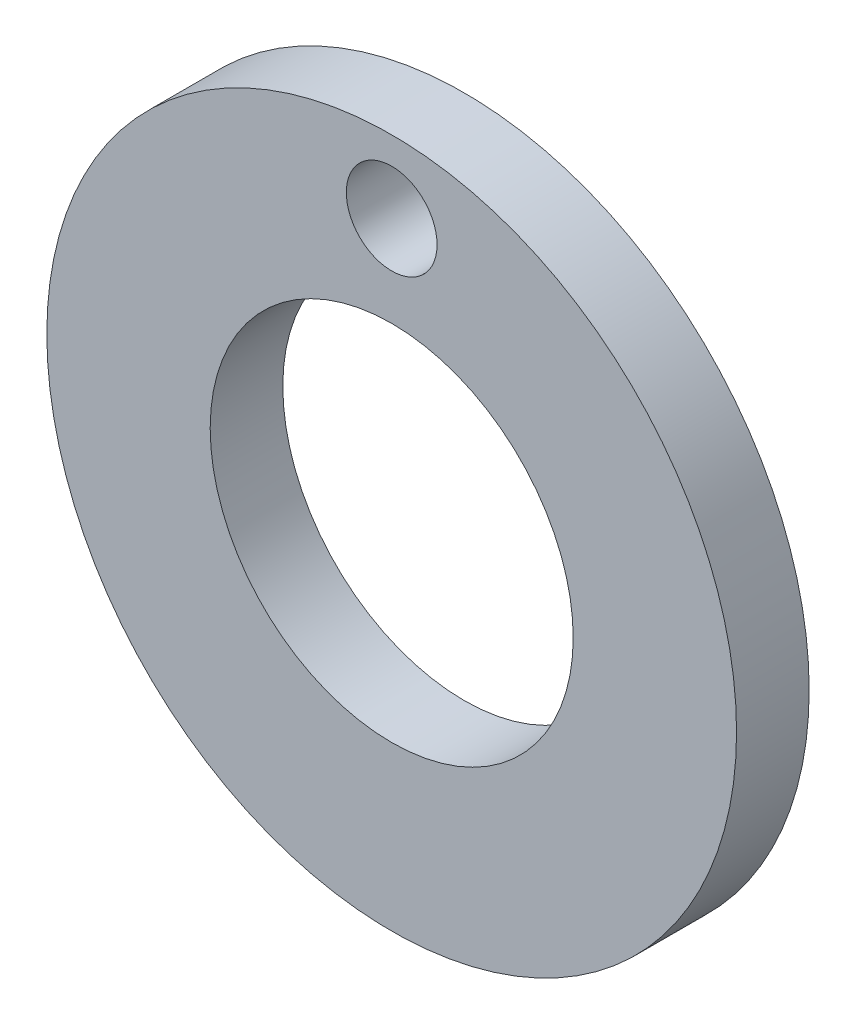
ISO-10303-21;
HEADER;
FILE_DESCRIPTION(('STEP AP214'),'2;1');
FILE_NAME('part.step','',(''),(''),'','','');
FILE_SCHEMA(('AUTOMOTIVE_DESIGN { 1 0 10303 214 1 1 1 1 }'));
ENDSEC;
DATA;
#1=APPLICATION_CONTEXT('core data for automotive mechanical design processes');
#2=APPLICATION_PROTOCOL_DEFINITION('international standard','automotive_design',2000,#1);
#3=PRODUCT_CONTEXT('',#1,'mechanical');
#4=PRODUCT('Part','Part','',(#3));
#5=PRODUCT_RELATED_PRODUCT_CATEGORY('part','',(#4));
#6=PRODUCT_DEFINITION_FORMATION('','',#4);
#7=PRODUCT_DEFINITION_CONTEXT('part definition',#1,'design');
#8=PRODUCT_DEFINITION('design','',#6,#7);
#9=PRODUCT_DEFINITION_SHAPE('','',#8);
#10=(LENGTH_UNIT() NAMED_UNIT(*) SI_UNIT(.MILLI.,.METRE.));
#11=(NAMED_UNIT(*) PLANE_ANGLE_UNIT() SI_UNIT($,.RADIAN.));
#12=(NAMED_UNIT(*) SI_UNIT($,.STERADIAN.) SOLID_ANGLE_UNIT());
#13=UNCERTAINTY_MEASURE_WITH_UNIT(LENGTH_MEASURE(1.E-05),#10,'distance_accuracy_value','');
#14=(GEOMETRIC_REPRESENTATION_CONTEXT(3) GLOBAL_UNCERTAINTY_ASSIGNED_CONTEXT((#13)) GLOBAL_UNIT_ASSIGNED_CONTEXT((#10,
#11,#12)) REPRESENTATION_CONTEXT('',''));
#15=CARTESIAN_POINT('',(0.,0.,0.));
#16=DIRECTION('',(0.,0.,1.));
#17=DIRECTION('',(1.,0.,0.));
#18=AXIS2_PLACEMENT_3D('',#15,#16,#17);
#19=CARTESIAN_POINT('',(0.,0.,2.));
#20=DIRECTION('',(0.,0.,-1.));
#21=DIRECTION('',(-1.,0.,0.));
#22=AXIS2_PLACEMENT_3D('',#19,#20,#21);
#23=CYLINDRICAL_SURFACE('',#22,9.5);
#24=CARTESIAN_POINT('',(0.,0.,2.));
#25=DIRECTION('',(0.,0.,1.));
#26=DIRECTION('',(1.,0.,0.));
#27=AXIS2_PLACEMENT_3D('',#24,#25,#26);
#28=CIRCLE('',#27,9.5);
#29=CARTESIAN_POINT('',(9.5,0.,2.));
#30=VERTEX_POINT('',#29);
#31=EDGE_CURVE('E48',#30,#30,#28,.T.);
#32=ORIENTED_EDGE('',*,*,#31,.F.);
#33=EDGE_LOOP('',(#32));
#34=FACE_BOUND('',#33,.T.);
#35=CARTESIAN_POINT('',(0.,0.,0.));
#36=DIRECTION('',(0.,0.,1.));
#37=DIRECTION('',(1.,0.,0.));
#38=AXIS2_PLACEMENT_3D('',#35,#36,#37);
#39=CIRCLE('',#38,9.5);
#40=CARTESIAN_POINT('',(9.5,0.,0.));
#41=VERTEX_POINT('',#40);
#42=EDGE_CURVE('E61',#41,#41,#39,.T.);
#43=ORIENTED_EDGE('',*,*,#42,.T.);
#44=EDGE_LOOP('',(#43));
#45=FACE_BOUND('',#44,.T.);
#46=ADVANCED_FACE('F39',(#34,#45),#23,.T.);
#47=CARTESIAN_POINT('',(0.,7.5,2.));
#48=DIRECTION('',(0.,0.,-1.));
#49=DIRECTION('',(-1.,0.,0.));
#50=AXIS2_PLACEMENT_3D('',#47,#48,#49);
#51=CYLINDRICAL_SURFACE('',#50,1.25);
#52=CARTESIAN_POINT('',(0.,7.5,2.));
#53=DIRECTION('',(0.,0.,1.));
#54=DIRECTION('',(1.,0.,0.));
#55=AXIS2_PLACEMENT_3D('',#52,#53,#54);
#56=CIRCLE('',#55,1.25);
#57=CARTESIAN_POINT('',(1.25,7.5,2.));
#58=VERTEX_POINT('',#57);
#59=EDGE_CURVE('E54',#58,#58,#56,.T.);
#60=ORIENTED_EDGE('',*,*,#59,.T.);
#61=EDGE_LOOP('',(#60));
#62=FACE_BOUND('',#61,.T.);
#63=CARTESIAN_POINT('',(0.,7.5,0.));
#64=DIRECTION('',(0.,0.,1.));
#65=DIRECTION('',(1.,0.,0.));
#66=AXIS2_PLACEMENT_3D('',#63,#64,#65);
#67=CIRCLE('',#66,1.25);
#68=CARTESIAN_POINT('',(1.25,7.5,0.));
#69=VERTEX_POINT('',#68);
#70=EDGE_CURVE('E58',#69,#69,#67,.T.);
#71=ORIENTED_EDGE('',*,*,#70,.F.);
#72=EDGE_LOOP('',(#71));
#73=FACE_BOUND('',#72,.T.);
#74=ADVANCED_FACE('F41',(#62,#73),#51,.F.);
#75=CARTESIAN_POINT('',(0.,0.,2.));
#76=DIRECTION('',(0.,0.,-1.));
#77=DIRECTION('',(-1.,0.,0.));
#78=AXIS2_PLACEMENT_3D('',#75,#76,#77);
#79=CYLINDRICAL_SURFACE('',#78,5.);
#80=CARTESIAN_POINT('',(0.,0.,2.));
#81=DIRECTION('',(0.,0.,1.));
#82=DIRECTION('',(1.,0.,0.));
#83=AXIS2_PLACEMENT_3D('',#80,#81,#82);
#84=CIRCLE('',#83,5.);
#85=CARTESIAN_POINT('',(5.,0.,2.));
#86=VERTEX_POINT('',#85);
#87=EDGE_CURVE('E10',#86,#86,#84,.T.);
#88=ORIENTED_EDGE('',*,*,#87,.T.);
#89=EDGE_LOOP('',(#88));
#90=FACE_BOUND('',#89,.T.);
#91=CARTESIAN_POINT('',(0.,0.,0.));
#92=DIRECTION('',(0.,0.,1.));
#93=DIRECTION('',(1.,0.,0.));
#94=AXIS2_PLACEMENT_3D('',#91,#92,#93);
#95=CIRCLE('',#94,5.);
#96=CARTESIAN_POINT('',(5.,0.,0.));
#97=VERTEX_POINT('',#96);
#98=EDGE_CURVE('E43',#97,#97,#95,.T.);
#99=ORIENTED_EDGE('',*,*,#98,.F.);
#100=EDGE_LOOP('',(#99));
#101=FACE_BOUND('',#100,.T.);
#102=ADVANCED_FACE('F80',(#90,#101),#79,.F.);
#103=CARTESIAN_POINT('',(0.,0.,2.));
#104=DIRECTION('',(0.,0.,1.));
#105=DIRECTION('',(1.,0.,0.));
#106=AXIS2_PLACEMENT_3D('',#103,#104,#105);
#107=PLANE('',#106);
#108=ORIENTED_EDGE('',*,*,#59,.F.);
#109=EDGE_LOOP('',(#108));
#110=FACE_BOUND('',#109,.T.);
#111=ORIENTED_EDGE('',*,*,#31,.T.);
#112=EDGE_LOOP('',(#111));
#113=FACE_BOUND('',#112,.T.);
#114=ORIENTED_EDGE('',*,*,#87,.F.);
#115=EDGE_LOOP('',(#114));
#116=FACE_BOUND('',#115,.T.);
#117=ADVANCED_FACE('F76',(#110,#113,#116),#107,.T.);
#118=CARTESIAN_POINT('',(0.,0.,0.));
#119=DIRECTION('',(0.,0.,1.));
#120=DIRECTION('',(1.,0.,0.));
#121=AXIS2_PLACEMENT_3D('',#118,#119,#120);
#122=PLANE('',#121);
#123=ORIENTED_EDGE('',*,*,#70,.T.);
#124=EDGE_LOOP('',(#123));
#125=FACE_BOUND('',#124,.T.);
#126=ORIENTED_EDGE('',*,*,#42,.F.);
#127=EDGE_LOOP('',(#126));
#128=FACE_BOUND('',#127,.T.);
#129=ORIENTED_EDGE('',*,*,#98,.T.);
#130=EDGE_LOOP('',(#129));
#131=FACE_BOUND('',#130,.T.);
#132=ADVANCED_FACE('F79',(#125,#128,#131),#122,.F.);
#133=CLOSED_SHELL('',(#46,#74,#102,#117,#132));
#134=MANIFOLD_SOLID_BREP('B2',#133);
#135=ADVANCED_BREP_SHAPE_REPRESENTATION('',(#18,#134),#14);
#136=SHAPE_DEFINITION_REPRESENTATION(#9,#135);
ENDSEC;
END-ISO-10303-21;
